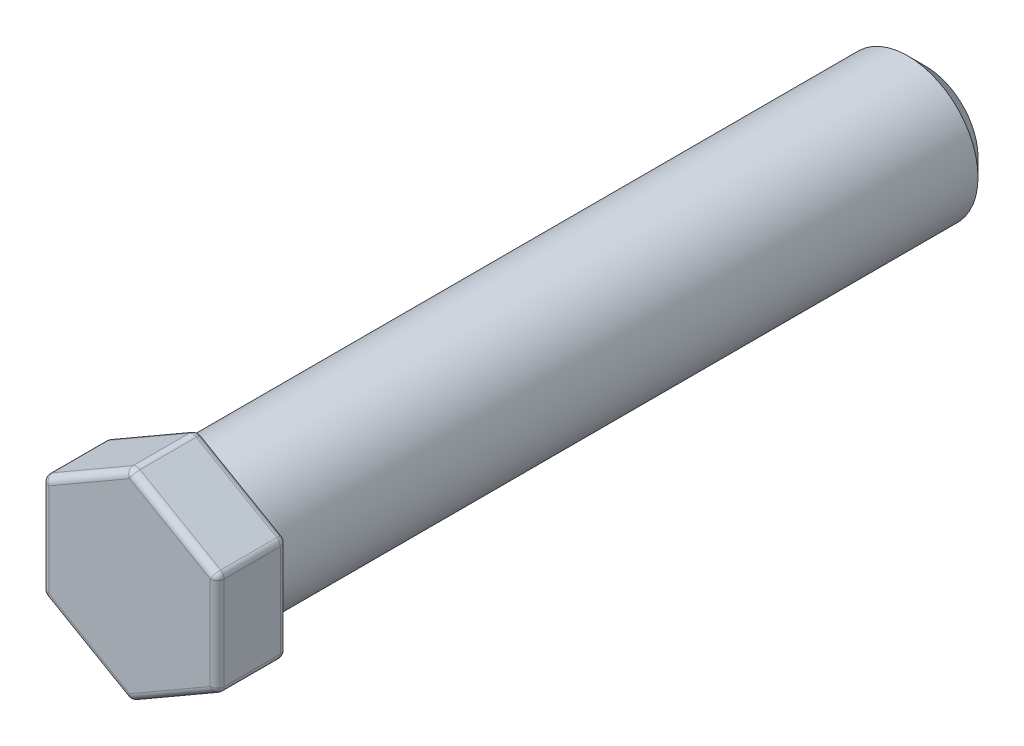
ISO-10303-21;
HEADER;
FILE_DESCRIPTION(('STEP AP214'),'2;1');
FILE_NAME('part.step','',(''),(''),'','','');
FILE_SCHEMA(('AUTOMOTIVE_DESIGN { 1 0 10303 214 1 1 1 1 }'));
ENDSEC;
DATA;
#1=APPLICATION_CONTEXT('core data for automotive mechanical design processes');
#2=APPLICATION_PROTOCOL_DEFINITION('international standard','automotive_design',2000,#1);
#3=PRODUCT_CONTEXT('',#1,'mechanical');
#4=PRODUCT('Part','Part','',(#3));
#5=PRODUCT_RELATED_PRODUCT_CATEGORY('part','',(#4));
#6=PRODUCT_DEFINITION_FORMATION('','',#4);
#7=PRODUCT_DEFINITION_CONTEXT('part definition',#1,'design');
#8=PRODUCT_DEFINITION('design','',#6,#7);
#9=PRODUCT_DEFINITION_SHAPE('','',#8);
#10=(LENGTH_UNIT() NAMED_UNIT(*) SI_UNIT(.MILLI.,.METRE.));
#11=(NAMED_UNIT(*) PLANE_ANGLE_UNIT() SI_UNIT($,.RADIAN.));
#12=(NAMED_UNIT(*) SI_UNIT($,.STERADIAN.) SOLID_ANGLE_UNIT());
#13=UNCERTAINTY_MEASURE_WITH_UNIT(LENGTH_MEASURE(1.E-05),#10,'distance_accuracy_value','');
#14=(GEOMETRIC_REPRESENTATION_CONTEXT(3) GLOBAL_UNCERTAINTY_ASSIGNED_CONTEXT((#13)) GLOBAL_UNIT_ASSIGNED_CONTEXT((#10,
#11,#12)) REPRESENTATION_CONTEXT('',''));
#15=CARTESIAN_POINT('',(0.,0.,0.));
#16=DIRECTION('',(0.,0.,1.));
#17=DIRECTION('',(1.,0.,0.));
#18=AXIS2_PLACEMENT_3D('',#15,#16,#17);
#19=CARTESIAN_POINT('',(0.,0.,20.7));
#20=DIRECTION('',(0.,0.,-1.));
#21=DIRECTION('',(-1.,0.,0.));
#22=AXIS2_PLACEMENT_3D('',#19,#20,#21);
#23=CYLINDRICAL_SURFACE('',#22,2.);
#24=CARTESIAN_POINT('',(0.,0.,0.500000000000007));
#25=DIRECTION('',(0.,0.,1.));
#26=DIRECTION('',(1.,0.,0.));
#27=AXIS2_PLACEMENT_3D('',#24,#25,#26);
#28=CIRCLE('',#27,2.);
#29=CARTESIAN_POINT('',(2.,0.,0.500000000000007));
#30=VERTEX_POINT('',#29);
#31=EDGE_CURVE('E43',#30,#30,#28,.T.);
#32=ORIENTED_EDGE('',*,*,#31,.T.);
#33=EDGE_LOOP('',(#32));
#34=FACE_BOUND('',#33,.T.);
#35=CARTESIAN_POINT('',(0.,0.,20.5));
#36=DIRECTION('',(0.,0.,1.));
#37=DIRECTION('',(1.,0.,0.));
#38=AXIS2_PLACEMENT_3D('',#35,#36,#37);
#39=CIRCLE('',#38,2.);
#40=CARTESIAN_POINT('',(2.,0.,20.5));
#41=VERTEX_POINT('',#40);
#42=EDGE_CURVE('E260',#41,#41,#39,.F.);
#43=ORIENTED_EDGE('',*,*,#42,.T.);
#44=EDGE_LOOP('',(#43));
#45=FACE_BOUND('',#44,.T.);
#46=ADVANCED_FACE('F35',(#34,#45),#23,.T.);
#47=CARTESIAN_POINT('',(0.,0.,0.));
#48=DIRECTION('',(0.,0.,1.));
#49=DIRECTION('',(1.,0.,0.));
#50=AXIS2_PLACEMENT_3D('',#47,#48,#49);
#51=PLANE('',#50);
#52=CARTESIAN_POINT('',(0.,0.,0.));
#53=DIRECTION('',(0.,0.,1.));
#54=DIRECTION('',(1.,0.,0.));
#55=AXIS2_PLACEMENT_3D('',#52,#53,#54);
#56=CIRCLE('',#55,1.49999999999999);
#57=CARTESIAN_POINT('',(1.49999999999999,0.,0.));
#58=VERTEX_POINT('',#57);
#59=EDGE_CURVE('E11',#58,#58,#56,.F.);
#60=ORIENTED_EDGE('',*,*,#59,.T.);
#61=EDGE_LOOP('',(#60));
#62=FACE_BOUND('',#61,.T.);
#63=ADVANCED_FACE('F374',(#62),#51,.F.);
#64=CARTESIAN_POINT('',(0.,-2.88675134594813,22.7));
#65=DIRECTION('',(-0.5,0.866025403784439,0.));
#66=DIRECTION('',(-0.866025403784439,-0.5,0.));
#67=AXIS2_PLACEMENT_3D('',#64,#65,#66);
#68=PLANE('',#67);
#69=DIRECTION('',(0.866025403784439,0.5,0.));
#70=VECTOR('',#69,1.);
#71=CARTESIAN_POINT('',(0.,-2.88675134594813,22.5));
#72=LINE('',#71,#70);
#73=CARTESIAN_POINT('',(2.4,-1.50111069989303,22.5));
#74=VERTEX_POINT('',#73);
#75=CARTESIAN_POINT('',(0.0999999999999994,-2.82901631902917,22.5));
#76=VERTEX_POINT('',#75);
#77=EDGE_CURVE('E237',#74,#76,#72,.F.);
#78=ORIENTED_EDGE('',*,*,#77,.T.);
#79=DIRECTION('',(0.,0.,-1.));
#80=VECTOR('',#79,1.);
#81=CARTESIAN_POINT('',(0.0999999999999995,-2.82901631902917,22.7));
#82=LINE('',#81,#80);
#83=CARTESIAN_POINT('',(0.0999999999999995,-2.82901631902917,20.9));
#84=VERTEX_POINT('',#83);
#85=EDGE_CURVE('E308',#76,#84,#82,.T.);
#86=ORIENTED_EDGE('',*,*,#85,.T.);
#87=DIRECTION('',(0.866025403784439,0.5,0.));
#88=VECTOR('',#87,1.);
#89=CARTESIAN_POINT('',(0.,-2.88675134594813,20.9));
#90=LINE('',#89,#88);
#91=CARTESIAN_POINT('',(2.4,-1.50111069989303,20.9));
#92=VERTEX_POINT('',#91);
#93=EDGE_CURVE('E234',#84,#92,#90,.T.);
#94=ORIENTED_EDGE('',*,*,#93,.T.);
#95=DIRECTION('',(0.,0.,-1.));
#96=VECTOR('',#95,1.);
#97=CARTESIAN_POINT('',(2.4,-1.50111069989303,22.7));
#98=LINE('',#97,#96);
#99=EDGE_CURVE('E306',#92,#74,#98,.F.);
#100=ORIENTED_EDGE('',*,*,#99,.T.);
#101=EDGE_LOOP('',(#78,#86,#94,#100));
#102=FACE_BOUND('',#101,.T.);
#103=ADVANCED_FACE('F379',(#102),#68,.F.);
#104=CARTESIAN_POINT('',(2.5,-1.44337567297407,22.7));
#105=DIRECTION('',(-1.,0.,0.));
#106=DIRECTION('',(0.,-1.,0.));
#107=AXIS2_PLACEMENT_3D('',#104,#105,#106);
#108=PLANE('',#107);
#109=DIRECTION('',(0.,1.,0.));
#110=VECTOR('',#109,1.);
#111=CARTESIAN_POINT('',(2.5,-1.44337567297407,20.9));
#112=LINE('',#111,#110);
#113=CARTESIAN_POINT('',(2.5,-1.32790561913614,20.9));
#114=VERTEX_POINT('',#113);
#115=CARTESIAN_POINT('',(2.5,1.32790561913614,20.9));
#116=VERTEX_POINT('',#115);
#117=EDGE_CURVE('E228',#114,#116,#112,.T.);
#118=ORIENTED_EDGE('',*,*,#117,.T.);
#119=DIRECTION('',(0.,0.,-1.));
#120=VECTOR('',#119,1.);
#121=CARTESIAN_POINT('',(2.5,1.32790561913614,22.7));
#122=LINE('',#121,#120);
#123=CARTESIAN_POINT('',(2.5,1.32790561913614,22.5));
#124=VERTEX_POINT('',#123);
#125=EDGE_CURVE('E327',#116,#124,#122,.F.);
#126=ORIENTED_EDGE('',*,*,#125,.T.);
#127=DIRECTION('',(0.,1.,0.));
#128=VECTOR('',#127,1.);
#129=CARTESIAN_POINT('',(2.5,-1.44337567297407,22.5));
#130=LINE('',#129,#128);
#131=CARTESIAN_POINT('',(2.5,-1.32790561913614,22.5));
#132=VERTEX_POINT('',#131);
#133=EDGE_CURVE('E231',#124,#132,#130,.F.);
#134=ORIENTED_EDGE('',*,*,#133,.T.);
#135=DIRECTION('',(0.,0.,-1.));
#136=VECTOR('',#135,1.);
#137=CARTESIAN_POINT('',(2.5,-1.32790561913614,22.7));
#138=LINE('',#137,#136);
#139=EDGE_CURVE('E325',#132,#114,#138,.T.);
#140=ORIENTED_EDGE('',*,*,#139,.T.);
#141=EDGE_LOOP('',(#118,#126,#134,#140));
#142=FACE_BOUND('',#141,.T.);
#143=ADVANCED_FACE('F558',(#142),#108,.F.);
#144=CARTESIAN_POINT('',(2.5,1.44337567297407,22.7));
#145=DIRECTION('',(-0.5,-0.866025403784439,0.));
#146=DIRECTION('',(0.866025403784439,-0.5,0.));
#147=AXIS2_PLACEMENT_3D('',#144,#145,#146);
#148=PLANE('',#147);
#149=DIRECTION('',(-0.866025403784439,0.5,0.));
#150=VECTOR('',#149,1.);
#151=CARTESIAN_POINT('',(2.5,1.44337567297407,22.5));
#152=LINE('',#151,#150);
#153=CARTESIAN_POINT('',(0.0999999999999994,2.82901631902917,22.5));
#154=VERTEX_POINT('',#153);
#155=CARTESIAN_POINT('',(2.4,1.50111069989303,22.5));
#156=VERTEX_POINT('',#155);
#157=EDGE_CURVE('E226',#154,#156,#152,.F.);
#158=ORIENTED_EDGE('',*,*,#157,.T.);
#159=DIRECTION('',(0.,0.,-1.));
#160=VECTOR('',#159,1.);
#161=CARTESIAN_POINT('',(2.4,1.50111069989303,22.7));
#162=LINE('',#161,#160);
#163=CARTESIAN_POINT('',(2.4,1.50111069989303,20.9));
#164=VERTEX_POINT('',#163);
#165=EDGE_CURVE('E57',#156,#164,#162,.T.);
#166=ORIENTED_EDGE('',*,*,#165,.T.);
#167=DIRECTION('',(-0.866025403784439,0.5,0.));
#168=VECTOR('',#167,1.);
#169=CARTESIAN_POINT('',(2.5,1.44337567297407,20.9));
#170=LINE('',#169,#168);
#171=CARTESIAN_POINT('',(0.0999999999999994,2.82901631902917,20.9));
#172=VERTEX_POINT('',#171);
#173=EDGE_CURVE('E224',#164,#172,#170,.T.);
#174=ORIENTED_EDGE('',*,*,#173,.T.);
#175=DIRECTION('',(0.,0.,-1.));
#176=VECTOR('',#175,1.);
#177=CARTESIAN_POINT('',(0.0999999999999994,2.82901631902917,22.7));
#178=LINE('',#177,#176);
#179=EDGE_CURVE('E322',#172,#154,#178,.F.);
#180=ORIENTED_EDGE('',*,*,#179,.T.);
#181=EDGE_LOOP('',(#158,#166,#174,#180));
#182=FACE_BOUND('',#181,.T.);
#183=ADVANCED_FACE('F503',(#182),#148,.F.);
#184=CARTESIAN_POINT('',(0.,2.88675134594813,22.7));
#185=DIRECTION('',(0.5,-0.866025403784439,0.));
#186=DIRECTION('',(0.866025403784439,0.5,0.));
#187=AXIS2_PLACEMENT_3D('',#184,#185,#186);
#188=PLANE('',#187);
#189=DIRECTION('',(-0.866025403784439,-0.5,0.));
#190=VECTOR('',#189,1.);
#191=CARTESIAN_POINT('',(0.,2.88675134594813,20.9));
#192=LINE('',#191,#190);
#193=CARTESIAN_POINT('',(-0.1,2.82901631902917,20.9));
#194=VERTEX_POINT('',#193);
#195=CARTESIAN_POINT('',(-2.4,1.50111069989303,20.9));
#196=VERTEX_POINT('',#195);
#197=EDGE_CURVE('E218',#194,#196,#192,.T.);
#198=ORIENTED_EDGE('',*,*,#197,.T.);
#199=DIRECTION('',(0.,0.,-1.));
#200=VECTOR('',#199,1.);
#201=CARTESIAN_POINT('',(-2.4,1.50111069989303,22.7));
#202=LINE('',#201,#200);
#203=CARTESIAN_POINT('',(-2.4,1.50111069989303,22.5));
#204=VERTEX_POINT('',#203);
#205=EDGE_CURVE('E320',#196,#204,#202,.F.);
#206=ORIENTED_EDGE('',*,*,#205,.T.);
#207=DIRECTION('',(-0.866025403784439,-0.5,0.));
#208=VECTOR('',#207,1.);
#209=CARTESIAN_POINT('',(0.,2.88675134594813,22.5));
#210=LINE('',#209,#208);
#211=CARTESIAN_POINT('',(-0.1,2.82901631902917,22.5));
#212=VERTEX_POINT('',#211);
#213=EDGE_CURVE('E221',#204,#212,#210,.F.);
#214=ORIENTED_EDGE('',*,*,#213,.T.);
#215=DIRECTION('',(0.,0.,-1.));
#216=VECTOR('',#215,1.);
#217=CARTESIAN_POINT('',(-0.1,2.82901631902917,22.7));
#218=LINE('',#217,#216);
#219=EDGE_CURVE('E318',#212,#194,#218,.T.);
#220=ORIENTED_EDGE('',*,*,#219,.T.);
#221=EDGE_LOOP('',(#198,#206,#214,#220));
#222=FACE_BOUND('',#221,.T.);
#223=ADVANCED_FACE('F512',(#222),#188,.F.);
#224=CARTESIAN_POINT('',(-2.5,1.44337567297407,22.7));
#225=DIRECTION('',(1.,0.,0.));
#226=DIRECTION('',(0.,1.,0.));
#227=AXIS2_PLACEMENT_3D('',#224,#225,#226);
#228=PLANE('',#227);
#229=DIRECTION('',(0.,-1.,0.));
#230=VECTOR('',#229,1.);
#231=CARTESIAN_POINT('',(-2.5,1.44337567297407,20.9));
#232=LINE('',#231,#230);
#233=CARTESIAN_POINT('',(-2.5,1.32790561913614,20.9));
#234=VERTEX_POINT('',#233);
#235=CARTESIAN_POINT('',(-2.5,-1.32790561913614,20.9));
#236=VERTEX_POINT('',#235);
#237=EDGE_CURVE('E212',#234,#236,#232,.T.);
#238=ORIENTED_EDGE('',*,*,#237,.T.);
#239=DIRECTION('',(0.,0.,-1.));
#240=VECTOR('',#239,1.);
#241=CARTESIAN_POINT('',(-2.5,-1.32790561913614,22.7));
#242=LINE('',#241,#240);
#243=CARTESIAN_POINT('',(-2.5,-1.32790561913614,22.5));
#244=VERTEX_POINT('',#243);
#245=EDGE_CURVE('E316',#236,#244,#242,.F.);
#246=ORIENTED_EDGE('',*,*,#245,.T.);
#247=DIRECTION('',(0.,-1.,0.));
#248=VECTOR('',#247,1.);
#249=CARTESIAN_POINT('',(-2.5,1.44337567297407,22.5));
#250=LINE('',#249,#248);
#251=CARTESIAN_POINT('',(-2.5,1.32790561913614,22.5));
#252=VERTEX_POINT('',#251);
#253=EDGE_CURVE('E215',#244,#252,#250,.F.);
#254=ORIENTED_EDGE('',*,*,#253,.T.);
#255=DIRECTION('',(0.,0.,-1.));
#256=VECTOR('',#255,1.);
#257=CARTESIAN_POINT('',(-2.5,1.32790561913614,22.7));
#258=LINE('',#257,#256);
#259=EDGE_CURVE('E314',#252,#234,#258,.T.);
#260=ORIENTED_EDGE('',*,*,#259,.T.);
#261=EDGE_LOOP('',(#238,#246,#254,#260));
#262=FACE_BOUND('',#261,.T.);
#263=ADVANCED_FACE('F576',(#262),#228,.F.);
#264=CARTESIAN_POINT('',(-2.5,-1.44337567297406,22.7));
#265=DIRECTION('',(0.5,0.866025403784439,0.));
#266=DIRECTION('',(-0.866025403784439,0.5,0.));
#267=AXIS2_PLACEMENT_3D('',#264,#265,#266);
#268=PLANE('',#267);
#269=DIRECTION('',(0.866025403784439,-0.5,0.));
#270=VECTOR('',#269,1.);
#271=CARTESIAN_POINT('',(-2.5,-1.44337567297406,20.9));
#272=LINE('',#271,#270);
#273=CARTESIAN_POINT('',(-2.4,-1.50111069989303,20.9));
#274=VERTEX_POINT('',#273);
#275=CARTESIAN_POINT('',(-0.1,-2.82901631902917,20.9));
#276=VERTEX_POINT('',#275);
#277=EDGE_CURVE('E203',#274,#276,#272,.T.);
#278=ORIENTED_EDGE('',*,*,#277,.T.);
#279=DIRECTION('',(0.,0.,-1.));
#280=VECTOR('',#279,1.);
#281=CARTESIAN_POINT('',(-0.1,-2.82901631902917,22.7));
#282=LINE('',#281,#280);
#283=CARTESIAN_POINT('',(-0.1,-2.82901631902917,22.5));
#284=VERTEX_POINT('',#283);
#285=EDGE_CURVE('E312',#276,#284,#282,.F.);
#286=ORIENTED_EDGE('',*,*,#285,.T.);
#287=DIRECTION('',(0.866025403784439,-0.5,0.));
#288=VECTOR('',#287,1.);
#289=CARTESIAN_POINT('',(-2.5,-1.44337567297406,22.5));
#290=LINE('',#289,#288);
#291=CARTESIAN_POINT('',(-2.4,-1.50111069989303,22.5));
#292=VERTEX_POINT('',#291);
#293=EDGE_CURVE('E184',#284,#292,#290,.F.);
#294=ORIENTED_EDGE('',*,*,#293,.T.);
#295=DIRECTION('',(0.,0.,-1.));
#296=VECTOR('',#295,1.);
#297=CARTESIAN_POINT('',(-2.4,-1.50111069989303,22.7));
#298=LINE('',#297,#296);
#299=EDGE_CURVE('E310',#292,#274,#298,.T.);
#300=ORIENTED_EDGE('',*,*,#299,.T.);
#301=EDGE_LOOP('',(#278,#286,#294,#300));
#302=FACE_BOUND('',#301,.T.);
#303=ADVANCED_FACE('F528',(#302),#268,.F.);
#304=CARTESIAN_POINT('',(0.,0.,22.7));
#305=DIRECTION('',(0.,0.,1.));
#306=DIRECTION('',(1.,0.,0.));
#307=AXIS2_PLACEMENT_3D('',#304,#305,#306);
#308=PLANE('',#307);
#309=DIRECTION('',(0.,-1.,0.));
#310=VECTOR('',#309,1.);
#311=CARTESIAN_POINT('',(-2.3,-1.44337567297406,22.7));
#312=LINE('',#311,#310);
#313=CARTESIAN_POINT('',(-2.3,1.32790561913614,22.7));
#314=VERTEX_POINT('',#313);
#315=CARTESIAN_POINT('',(-2.3,-1.32790561913614,22.7));
#316=VERTEX_POINT('',#315);
#317=EDGE_CURVE('E202',#314,#316,#312,.T.);
#318=ORIENTED_EDGE('',*,*,#317,.T.);
#319=DIRECTION('',(0.866025403784439,-0.5,0.));
#320=VECTOR('',#319,1.);
#321=CARTESIAN_POINT('',(0.0999999999999996,-2.71354626519124,22.7));
#322=LINE('',#321,#320);
#323=CARTESIAN_POINT('',(0.,-2.65581123827228,22.7));
#324=VERTEX_POINT('',#323);
#325=EDGE_CURVE('E181',#316,#324,#322,.T.);
#326=ORIENTED_EDGE('',*,*,#325,.T.);
#327=DIRECTION('',(0.866025403784439,0.5,0.));
#328=VECTOR('',#327,1.);
#329=CARTESIAN_POINT('',(2.4,-1.27017059221718,22.7));
#330=LINE('',#329,#328);
#331=CARTESIAN_POINT('',(2.3,-1.32790561913614,22.7));
#332=VERTEX_POINT('',#331);
#333=EDGE_CURVE('E189',#324,#332,#330,.T.);
#334=ORIENTED_EDGE('',*,*,#333,.T.);
#335=DIRECTION('',(0.,1.,0.));
#336=VECTOR('',#335,1.);
#337=CARTESIAN_POINT('',(2.3,1.44337567297407,22.7));
#338=LINE('',#337,#336);
#339=CARTESIAN_POINT('',(2.3,1.32790561913614,22.7));
#340=VERTEX_POINT('',#339);
#341=EDGE_CURVE('E195',#332,#340,#338,.T.);
#342=ORIENTED_EDGE('',*,*,#341,.T.);
#343=DIRECTION('',(-0.866025403784439,0.5,0.));
#344=VECTOR('',#343,1.);
#345=CARTESIAN_POINT('',(-0.1,2.71354626519124,22.7));
#346=LINE('',#345,#344);
#347=CARTESIAN_POINT('',(0.,2.65581123827228,22.7));
#348=VERTEX_POINT('',#347);
#349=EDGE_CURVE('E519',#340,#348,#346,.T.);
#350=ORIENTED_EDGE('',*,*,#349,.T.);
#351=DIRECTION('',(-0.866025403784439,-0.5,0.));
#352=VECTOR('',#351,1.);
#353=CARTESIAN_POINT('',(-2.4,1.27017059221718,22.7));
#354=LINE('',#353,#352);
#355=EDGE_CURVE('E207',#348,#314,#354,.T.);
#356=ORIENTED_EDGE('',*,*,#355,.T.);
#357=EDGE_LOOP('',(#318,#326,#334,#342,#350,#356));
#358=FACE_BOUND('',#357,.T.);
#359=ADVANCED_FACE('F199',(#358),#308,.T.);
#360=CARTESIAN_POINT('',(0.,0.,20.7));
#361=DIRECTION('',(0.,0.,1.));
#362=DIRECTION('',(1.,0.,0.));
#363=AXIS2_PLACEMENT_3D('',#360,#361,#362);
#364=PLANE('',#363);
#365=DIRECTION('',(-0.866025403784439,0.5,0.));
#366=VECTOR('',#365,1.);
#367=CARTESIAN_POINT('',(1.15,1.99185842870421,20.7));
#368=LINE('',#367,#366);
#369=CARTESIAN_POINT('',(0.,2.65581123827228,20.7));
#370=VERTEX_POINT('',#369);
#371=CARTESIAN_POINT('',(2.3,1.32790561913614,20.7));
#372=VERTEX_POINT('',#371);
#373=EDGE_CURVE('E254',#370,#372,#368,.F.);
#374=ORIENTED_EDGE('',*,*,#373,.T.);
#375=DIRECTION('',(0.,1.,0.));
#376=VECTOR('',#375,1.);
#377=CARTESIAN_POINT('',(2.3,0.,20.7));
#378=LINE('',#377,#376);
#379=CARTESIAN_POINT('',(2.3,-1.32790561913614,20.7));
#380=VERTEX_POINT('',#379);
#381=EDGE_CURVE('E257',#372,#380,#378,.F.);
#382=ORIENTED_EDGE('',*,*,#381,.T.);
#383=DIRECTION('',(0.866025403784439,0.5,0.));
#384=VECTOR('',#383,1.);
#385=CARTESIAN_POINT('',(1.15,-1.99185842870421,20.7));
#386=LINE('',#385,#384);
#387=CARTESIAN_POINT('',(0.,-2.65581123827228,20.7));
#388=VERTEX_POINT('',#387);
#389=EDGE_CURVE('E242',#380,#388,#386,.F.);
#390=ORIENTED_EDGE('',*,*,#389,.T.);
#391=DIRECTION('',(0.866025403784439,-0.5,0.));
#392=VECTOR('',#391,1.);
#393=CARTESIAN_POINT('',(-1.15,-1.99185842870421,20.7));
#394=LINE('',#393,#392);
#395=CARTESIAN_POINT('',(-2.3,-1.32790561913614,20.7));
#396=VERTEX_POINT('',#395);
#397=EDGE_CURVE('E245',#388,#396,#394,.F.);
#398=ORIENTED_EDGE('',*,*,#397,.T.);
#399=DIRECTION('',(0.,-1.,0.));
#400=VECTOR('',#399,1.);
#401=CARTESIAN_POINT('',(-2.3,0.,20.7));
#402=LINE('',#401,#400);
#403=CARTESIAN_POINT('',(-2.3,1.32790561913614,20.7));
#404=VERTEX_POINT('',#403);
#405=EDGE_CURVE('E248',#396,#404,#402,.F.);
#406=ORIENTED_EDGE('',*,*,#405,.T.);
#407=DIRECTION('',(-0.866025403784439,-0.5,0.));
#408=VECTOR('',#407,1.);
#409=CARTESIAN_POINT('',(-1.15,1.99185842870421,20.7));
#410=LINE('',#409,#408);
#411=EDGE_CURVE('E251',#404,#370,#410,.F.);
#412=ORIENTED_EDGE('',*,*,#411,.T.);
#413=EDGE_LOOP('',(#374,#382,#390,#398,#406,#412));
#414=FACE_BOUND('',#413,.T.);
#415=CARTESIAN_POINT('',(0.,0.,20.7));
#416=DIRECTION('',(0.,0.,1.));
#417=DIRECTION('',(1.,0.,0.));
#418=AXIS2_PLACEMENT_3D('',#415,#416,#417);
#419=CIRCLE('',#418,2.2);
#420=CARTESIAN_POINT('',(2.2,0.,20.7));
#421=VERTEX_POINT('',#420);
#422=EDGE_CURVE('E239',#421,#421,#419,.T.);
#423=ORIENTED_EDGE('',*,*,#422,.T.);
#424=EDGE_LOOP('',(#423));
#425=FACE_BOUND('',#424,.T.);
#426=ADVANCED_FACE('F404',(#414,#425),#364,.F.);
#427=CARTESIAN_POINT('',(1.15,1.99185842870421,22.5));
#428=DIRECTION('',(0.866025403784439,-0.5,0.));
#429=DIRECTION('',(0.5,0.866025403784439,0.));
#430=AXIS2_PLACEMENT_3D('',#427,#428,#429);
#431=CYLINDRICAL_SURFACE('',#430,0.2);
#432=ORIENTED_EDGE('',*,*,#349,.F.);
#433=CARTESIAN_POINT('',(2.3,1.32790561913614,22.5));
#434=DIRECTION('',(0.866025403784439,-0.5,0.));
#435=DIRECTION('',(0.5,0.866025403784439,0.));
#436=AXIS2_PLACEMENT_3D('',#433,#434,#435);
#437=CIRCLE('',#436,0.2);
#438=EDGE_CURVE('E297',#340,#156,#437,.F.);
#439=ORIENTED_EDGE('',*,*,#438,.T.);
#440=ORIENTED_EDGE('',*,*,#157,.F.);
#441=CARTESIAN_POINT('',(0.,2.65581123827228,22.5));
#442=DIRECTION('',(0.866025403784439,-0.5,0.));
#443=DIRECTION('',(0.5,0.866025403784439,0.));
#444=AXIS2_PLACEMENT_3D('',#441,#442,#443);
#445=CIRCLE('',#444,0.2);
#446=EDGE_CURVE('E295',#154,#348,#445,.T.);
#447=ORIENTED_EDGE('',*,*,#446,.T.);
#448=EDGE_LOOP('',(#432,#439,#440,#447));
#449=FACE_BOUND('',#448,.T.);
#450=ADVANCED_FACE('F400',(#449),#431,.T.);
#451=CARTESIAN_POINT('',(-1.15,1.99185842870421,22.5));
#452=DIRECTION('',(0.866025403784439,0.5,0.));
#453=DIRECTION('',(-0.5,0.866025403784439,0.));
#454=AXIS2_PLACEMENT_3D('',#451,#452,#453);
#455=CYLINDRICAL_SURFACE('',#454,0.2);
#456=ORIENTED_EDGE('',*,*,#213,.F.);
#457=CARTESIAN_POINT('',(-2.3,1.32790561913614,22.5));
#458=DIRECTION('',(0.866025403784439,0.5,0.));
#459=DIRECTION('',(-0.5,0.866025403784439,0.));
#460=AXIS2_PLACEMENT_3D('',#457,#458,#459);
#461=CIRCLE('',#460,0.2);
#462=EDGE_CURVE('E284',#204,#314,#461,.T.);
#463=ORIENTED_EDGE('',*,*,#462,.T.);
#464=ORIENTED_EDGE('',*,*,#355,.F.);
#465=CARTESIAN_POINT('',(0.,2.65581123827228,22.5));
#466=DIRECTION('',(0.866025403784439,0.5,0.));
#467=DIRECTION('',(-0.5,0.866025403784439,0.));
#468=AXIS2_PLACEMENT_3D('',#465,#466,#467);
#469=CIRCLE('',#468,0.2);
#470=EDGE_CURVE('E281',#348,#212,#469,.F.);
#471=ORIENTED_EDGE('',*,*,#470,.T.);
#472=EDGE_LOOP('',(#456,#463,#464,#471));
#473=FACE_BOUND('',#472,.T.);
#474=ADVANCED_FACE('F396',(#473),#455,.T.);
#475=CARTESIAN_POINT('',(2.3,0.,22.5));
#476=DIRECTION('',(0.,-1.,0.));
#477=DIRECTION('',(1.,0.,0.));
#478=AXIS2_PLACEMENT_3D('',#475,#476,#477);
#479=CYLINDRICAL_SURFACE('',#478,0.2);
#480=ORIENTED_EDGE('',*,*,#133,.F.);
#481=CARTESIAN_POINT('',(2.3,1.32790561913614,22.5));
#482=DIRECTION('',(0.,-1.,0.));
#483=DIRECTION('',(1.,0.,0.));
#484=AXIS2_PLACEMENT_3D('',#481,#482,#483);
#485=CIRCLE('',#484,0.2);
#486=EDGE_CURVE('E292',#124,#340,#485,.T.);
#487=ORIENTED_EDGE('',*,*,#486,.T.);
#488=ORIENTED_EDGE('',*,*,#341,.F.);
#489=CARTESIAN_POINT('',(2.3,-1.32790561913614,22.5));
#490=DIRECTION('',(0.,-1.,0.));
#491=DIRECTION('',(1.,0.,0.));
#492=AXIS2_PLACEMENT_3D('',#489,#490,#491);
#493=CIRCLE('',#492,0.2);
#494=EDGE_CURVE('E290',#332,#132,#493,.F.);
#495=ORIENTED_EDGE('',*,*,#494,.T.);
#496=EDGE_LOOP('',(#480,#487,#488,#495));
#497=FACE_BOUND('',#496,.T.);
#498=ADVANCED_FACE('F392',(#497),#479,.T.);
#499=CARTESIAN_POINT('',(-2.3,0.,22.5));
#500=DIRECTION('',(0.,1.,0.));
#501=DIRECTION('',(-1.,0.,0.));
#502=AXIS2_PLACEMENT_3D('',#499,#500,#501);
#503=CYLINDRICAL_SURFACE('',#502,0.2);
#504=ORIENTED_EDGE('',*,*,#253,.F.);
#505=CARTESIAN_POINT('',(-2.3,-1.32790561913614,22.5));
#506=DIRECTION('',(0.,1.,0.));
#507=DIRECTION('',(-1.,0.,0.));
#508=AXIS2_PLACEMENT_3D('',#505,#506,#507);
#509=CIRCLE('',#508,0.2);
#510=EDGE_CURVE('E275',#244,#316,#509,.T.);
#511=ORIENTED_EDGE('',*,*,#510,.T.);
#512=ORIENTED_EDGE('',*,*,#317,.F.);
#513=CARTESIAN_POINT('',(-2.3,1.32790561913614,22.5));
#514=DIRECTION('',(0.,1.,0.));
#515=DIRECTION('',(-1.,0.,0.));
#516=AXIS2_PLACEMENT_3D('',#513,#514,#515);
#517=CIRCLE('',#516,0.2);
#518=EDGE_CURVE('E272',#314,#252,#517,.F.);
#519=ORIENTED_EDGE('',*,*,#518,.T.);
#520=EDGE_LOOP('',(#504,#511,#512,#519));
#521=FACE_BOUND('',#520,.T.);
#522=ADVANCED_FACE('F389',(#521),#503,.T.);
#523=CARTESIAN_POINT('',(1.15,-1.99185842870421,22.5));
#524=DIRECTION('',(-0.866025403784439,-0.5,0.));
#525=DIRECTION('',(0.5,-0.866025403784439,0.));
#526=AXIS2_PLACEMENT_3D('',#523,#524,#525);
#527=CYLINDRICAL_SURFACE('',#526,0.2);
#528=ORIENTED_EDGE('',*,*,#333,.F.);
#529=CARTESIAN_POINT('',(0.,-2.65581123827228,22.5));
#530=DIRECTION('',(-0.866025403784439,-0.5,0.));
#531=DIRECTION('',(0.5,-0.866025403784439,0.));
#532=AXIS2_PLACEMENT_3D('',#529,#530,#531);
#533=CIRCLE('',#532,0.2);
#534=EDGE_CURVE('E162',#324,#76,#533,.F.);
#535=ORIENTED_EDGE('',*,*,#534,.T.);
#536=ORIENTED_EDGE('',*,*,#77,.F.);
#537=CARTESIAN_POINT('',(2.3,-1.32790561913614,22.5));
#538=DIRECTION('',(-0.866025403784439,-0.5,0.));
#539=DIRECTION('',(0.5,-0.866025403784439,0.));
#540=AXIS2_PLACEMENT_3D('',#537,#538,#539);
#541=CIRCLE('',#540,0.2);
#542=EDGE_CURVE('E173',#74,#332,#541,.T.);
#543=ORIENTED_EDGE('',*,*,#542,.T.);
#544=EDGE_LOOP('',(#528,#535,#536,#543));
#545=FACE_BOUND('',#544,.T.);
#546=ADVANCED_FACE('F190',(#545),#527,.T.);
#547=CARTESIAN_POINT('',(-1.15,-1.99185842870421,22.5));
#548=DIRECTION('',(-0.866025403784439,0.5,0.));
#549=DIRECTION('',(-0.5,-0.866025403784439,0.));
#550=AXIS2_PLACEMENT_3D('',#547,#548,#549);
#551=CYLINDRICAL_SURFACE('',#550,0.2);
#552=ORIENTED_EDGE('',*,*,#293,.F.);
#553=CARTESIAN_POINT('',(0.,-2.65581123827228,22.5));
#554=DIRECTION('',(-0.866025403784439,0.5,0.));
#555=DIRECTION('',(-0.5,-0.866025403784439,0.));
#556=AXIS2_PLACEMENT_3D('',#553,#554,#555);
#557=CIRCLE('',#556,0.2);
#558=EDGE_CURVE('E165',#284,#324,#557,.T.);
#559=ORIENTED_EDGE('',*,*,#558,.T.);
#560=ORIENTED_EDGE('',*,*,#325,.F.);
#561=CARTESIAN_POINT('',(-2.3,-1.32790561913614,22.5));
#562=DIRECTION('',(-0.866025403784439,0.5,0.));
#563=DIRECTION('',(-0.5,-0.866025403784439,0.));
#564=AXIS2_PLACEMENT_3D('',#561,#562,#563);
#565=CIRCLE('',#564,0.2);
#566=EDGE_CURVE('E185',#316,#292,#565,.F.);
#567=ORIENTED_EDGE('',*,*,#566,.T.);
#568=EDGE_LOOP('',(#552,#559,#560,#567));
#569=FACE_BOUND('',#568,.T.);
#570=ADVANCED_FACE('F178',(#569),#551,.T.);
#571=CARTESIAN_POINT('',(-2.3,1.44337567297407,20.9));
#572=DIRECTION('',(0.,-1.,0.));
#573=DIRECTION('',(1.,0.,0.));
#574=AXIS2_PLACEMENT_3D('',#571,#572,#573);
#575=CYLINDRICAL_SURFACE('',#574,0.2);
#576=ORIENTED_EDGE('',*,*,#405,.F.);
#577=CARTESIAN_POINT('',(-2.3,-1.32790561913614,20.9));
#578=DIRECTION('',(0.,-1.,0.));
#579=DIRECTION('',(1.,0.,0.));
#580=AXIS2_PLACEMENT_3D('',#577,#578,#579);
#581=CIRCLE('',#580,0.2);
#582=EDGE_CURVE('E279',#396,#236,#581,.F.);
#583=ORIENTED_EDGE('',*,*,#582,.T.);
#584=ORIENTED_EDGE('',*,*,#237,.F.);
#585=CARTESIAN_POINT('',(-2.3,1.32790561913614,20.9));
#586=DIRECTION('',(0.,-1.,0.));
#587=DIRECTION('',(1.,0.,0.));
#588=AXIS2_PLACEMENT_3D('',#585,#586,#587);
#589=CIRCLE('',#588,0.2);
#590=EDGE_CURVE('E277',#234,#404,#589,.T.);
#591=ORIENTED_EDGE('',*,*,#590,.T.);
#592=EDGE_LOOP('',(#576,#583,#584,#591));
#593=FACE_BOUND('',#592,.T.);
#594=ADVANCED_FACE('F386',(#593),#575,.T.);
#595=CARTESIAN_POINT('',(-2.4,-1.27017059221718,20.9));
#596=DIRECTION('',(0.866025403784439,-0.5,0.));
#597=DIRECTION('',(0.5,0.866025403784439,0.));
#598=AXIS2_PLACEMENT_3D('',#595,#596,#597);
#599=CYLINDRICAL_SURFACE('',#598,0.2);
#600=ORIENTED_EDGE('',*,*,#397,.F.);
#601=CARTESIAN_POINT('',(0.,-2.65581123827228,20.9));
#602=DIRECTION('',(0.866025403784439,-0.5,0.));
#603=DIRECTION('',(0.5,0.866025403784439,0.));
#604=AXIS2_PLACEMENT_3D('',#601,#602,#603);
#605=CIRCLE('',#604,0.2);
#606=EDGE_CURVE('E270',#388,#276,#605,.F.);
#607=ORIENTED_EDGE('',*,*,#606,.T.);
#608=ORIENTED_EDGE('',*,*,#277,.F.);
#609=CARTESIAN_POINT('',(-2.3,-1.32790561913614,20.9));
#610=DIRECTION('',(0.866025403784439,-0.5,0.));
#611=DIRECTION('',(0.5,0.866025403784439,0.));
#612=AXIS2_PLACEMENT_3D('',#609,#610,#611);
#613=CIRCLE('',#612,0.2);
#614=EDGE_CURVE('E268',#274,#396,#613,.T.);
#615=ORIENTED_EDGE('',*,*,#614,.T.);
#616=EDGE_LOOP('',(#600,#607,#608,#615));
#617=FACE_BOUND('',#616,.T.);
#618=ADVANCED_FACE('F421',(#617),#599,.T.);
#619=CARTESIAN_POINT('',(0.0999999999999996,2.71354626519124,20.9));
#620=DIRECTION('',(-0.866025403784439,-0.5,0.));
#621=DIRECTION('',(0.5,-0.866025403784439,0.));
#622=AXIS2_PLACEMENT_3D('',#619,#620,#621);
#623=CYLINDRICAL_SURFACE('',#622,0.2);
#624=ORIENTED_EDGE('',*,*,#411,.F.);
#625=CARTESIAN_POINT('',(-2.3,1.32790561913614,20.9));
#626=DIRECTION('',(-0.866025403784439,-0.5,0.));
#627=DIRECTION('',(0.5,-0.866025403784439,0.));
#628=AXIS2_PLACEMENT_3D('',#625,#626,#627);
#629=CIRCLE('',#628,0.2);
#630=EDGE_CURVE('E288',#404,#196,#629,.F.);
#631=ORIENTED_EDGE('',*,*,#630,.T.);
#632=ORIENTED_EDGE('',*,*,#197,.F.);
#633=CARTESIAN_POINT('',(0.,2.65581123827228,20.9));
#634=DIRECTION('',(-0.866025403784439,-0.5,0.));
#635=DIRECTION('',(0.5,-0.866025403784439,0.));
#636=AXIS2_PLACEMENT_3D('',#633,#634,#635);
#637=CIRCLE('',#636,0.2);
#638=EDGE_CURVE('E286',#194,#370,#637,.T.);
#639=ORIENTED_EDGE('',*,*,#638,.T.);
#640=EDGE_LOOP('',(#624,#631,#632,#639));
#641=FACE_BOUND('',#640,.T.);
#642=ADVANCED_FACE('F417',(#641),#623,.T.);
#643=CARTESIAN_POINT('',(-0.1,-2.71354626519124,20.9));
#644=DIRECTION('',(0.866025403784439,0.5,0.));
#645=DIRECTION('',(-0.5,0.866025403784439,0.));
#646=AXIS2_PLACEMENT_3D('',#643,#644,#645);
#647=CYLINDRICAL_SURFACE('',#646,0.2);
#648=ORIENTED_EDGE('',*,*,#93,.F.);
#649=CARTESIAN_POINT('',(0.,-2.65581123827228,20.9));
#650=DIRECTION('',(0.866025403784439,0.5,0.));
#651=DIRECTION('',(-0.5,0.866025403784439,0.));
#652=AXIS2_PLACEMENT_3D('',#649,#650,#651);
#653=CIRCLE('',#652,0.2);
#654=EDGE_CURVE('E266',#84,#388,#653,.T.);
#655=ORIENTED_EDGE('',*,*,#654,.T.);
#656=ORIENTED_EDGE('',*,*,#389,.F.);
#657=CARTESIAN_POINT('',(2.3,-1.32790561913614,20.9));
#658=DIRECTION('',(0.866025403784439,0.5,0.));
#659=DIRECTION('',(-0.5,0.866025403784439,0.));
#660=AXIS2_PLACEMENT_3D('',#657,#658,#659);
#661=CIRCLE('',#660,0.2);
#662=EDGE_CURVE('E172',#380,#92,#661,.F.);
#663=ORIENTED_EDGE('',*,*,#662,.T.);
#664=EDGE_LOOP('',(#648,#655,#656,#663));
#665=FACE_BOUND('',#664,.T.);
#666=ADVANCED_FACE('F414',(#665),#647,.T.);
#667=CARTESIAN_POINT('',(2.4,1.27017059221718,20.9));
#668=DIRECTION('',(-0.866025403784439,0.5,0.));
#669=DIRECTION('',(-0.5,-0.866025403784439,0.));
#670=AXIS2_PLACEMENT_3D('',#667,#668,#669);
#671=CYLINDRICAL_SURFACE('',#670,0.2);
#672=ORIENTED_EDGE('',*,*,#173,.F.);
#673=CARTESIAN_POINT('',(2.3,1.32790561913614,20.9));
#674=DIRECTION('',(-0.866025403784439,0.5,0.));
#675=DIRECTION('',(-0.5,-0.866025403784439,0.));
#676=AXIS2_PLACEMENT_3D('',#673,#674,#675);
#677=CIRCLE('',#676,0.2);
#678=EDGE_CURVE('E304',#164,#372,#677,.T.);
#679=ORIENTED_EDGE('',*,*,#678,.T.);
#680=ORIENTED_EDGE('',*,*,#373,.F.);
#681=CARTESIAN_POINT('',(0.,2.65581123827228,20.9));
#682=DIRECTION('',(-0.866025403784439,0.5,0.));
#683=DIRECTION('',(-0.5,-0.866025403784439,0.));
#684=AXIS2_PLACEMENT_3D('',#681,#682,#683);
#685=CIRCLE('',#684,0.2);
#686=EDGE_CURVE('E50',#370,#172,#685,.F.);
#687=ORIENTED_EDGE('',*,*,#686,.T.);
#688=EDGE_LOOP('',(#672,#679,#680,#687));
#689=FACE_BOUND('',#688,.T.);
#690=ADVANCED_FACE('F410',(#689),#671,.T.);
#691=CARTESIAN_POINT('',(2.3,-1.44337567297407,20.9));
#692=DIRECTION('',(0.,1.,0.));
#693=DIRECTION('',(-1.,0.,0.));
#694=AXIS2_PLACEMENT_3D('',#691,#692,#693);
#695=CYLINDRICAL_SURFACE('',#694,0.2);
#696=ORIENTED_EDGE('',*,*,#381,.F.);
#697=CARTESIAN_POINT('',(2.3,1.32790561913614,20.9));
#698=DIRECTION('',(0.,1.,0.));
#699=DIRECTION('',(-1.,0.,0.));
#700=AXIS2_PLACEMENT_3D('',#697,#698,#699);
#701=CIRCLE('',#700,0.2);
#702=EDGE_CURVE('E301',#372,#116,#701,.F.);
#703=ORIENTED_EDGE('',*,*,#702,.T.);
#704=ORIENTED_EDGE('',*,*,#117,.F.);
#705=CARTESIAN_POINT('',(2.3,-1.32790561913614,20.9));
#706=DIRECTION('',(0.,1.,0.));
#707=DIRECTION('',(-1.,0.,0.));
#708=AXIS2_PLACEMENT_3D('',#705,#706,#707);
#709=CIRCLE('',#708,0.2);
#710=EDGE_CURVE('E299',#114,#380,#709,.T.);
#711=ORIENTED_EDGE('',*,*,#710,.T.);
#712=EDGE_LOOP('',(#696,#703,#704,#711));
#713=FACE_BOUND('',#712,.T.);
#714=ADVANCED_FACE('F406',(#713),#695,.T.);
#715=CARTESIAN_POINT('',(0.,0.,20.5));
#716=DIRECTION('',(0.,0.,1.));
#717=DIRECTION('',(1.,0.,0.));
#718=AXIS2_PLACEMENT_3D('',#715,#716,#717);
#719=TOROIDAL_SURFACE('',#718,2.2,0.2);
#720=ORIENTED_EDGE('',*,*,#42,.F.);
#721=EDGE_LOOP('',(#720));
#722=FACE_BOUND('',#721,.T.);
#723=ORIENTED_EDGE('',*,*,#422,.F.);
#724=EDGE_LOOP('',(#723));
#725=FACE_BOUND('',#724,.T.);
#726=ADVANCED_FACE('F409',(#722,#725),#719,.F.);
#727=CARTESIAN_POINT('',(0.,-2.65581123827228,20.9));
#728=DIRECTION('',(0.,0.,1.));
#729=DIRECTION('',(1.,0.,0.));
#730=AXIS2_PLACEMENT_3D('',#727,#728,#729);
#731=SPHERICAL_SURFACE('',#730,0.2);
#732=ORIENTED_EDGE('',*,*,#606,.F.);
#733=ORIENTED_EDGE('',*,*,#654,.F.);
#734=CARTESIAN_POINT('',(0.,-2.65581123827228,20.9));
#735=DIRECTION('',(0.,0.,1.));
#736=DIRECTION('',(1.,0.,0.));
#737=AXIS2_PLACEMENT_3D('',#734,#735,#736);
#738=CIRCLE('',#737,0.2);
#739=EDGE_CURVE('E196',#276,#84,#738,.T.);
#740=ORIENTED_EDGE('',*,*,#739,.F.);
#741=EDGE_LOOP('',(#732,#733,#740));
#742=FACE_BOUND('',#741,.T.);
#743=ADVANCED_FACE('F431',(#742),#731,.T.);
#744=CARTESIAN_POINT('',(0.,-2.65581123827228,22.7));
#745=DIRECTION('',(0.,0.,-1.));
#746=DIRECTION('',(-1.,0.,0.));
#747=AXIS2_PLACEMENT_3D('',#744,#745,#746);
#748=CYLINDRICAL_SURFACE('',#747,0.2);
#749=ORIENTED_EDGE('',*,*,#739,.T.);
#750=ORIENTED_EDGE('',*,*,#85,.F.);
#751=CARTESIAN_POINT('',(0.,-2.65581123827228,22.5));
#752=DIRECTION('',(0.,0.,1.));
#753=DIRECTION('',(1.,0.,0.));
#754=AXIS2_PLACEMENT_3D('',#751,#752,#753);
#755=CIRCLE('',#754,0.2);
#756=EDGE_CURVE('E167',#284,#76,#755,.T.);
#757=ORIENTED_EDGE('',*,*,#756,.F.);
#758=ORIENTED_EDGE('',*,*,#285,.F.);
#759=EDGE_LOOP('',(#749,#750,#757,#758));
#760=FACE_BOUND('',#759,.T.);
#761=ADVANCED_FACE('F436',(#760),#748,.T.);
#762=CARTESIAN_POINT('',(0.,-2.65581123827228,22.5));
#763=DIRECTION('',(0.,0.,1.));
#764=DIRECTION('',(1.,0.,0.));
#765=AXIS2_PLACEMENT_3D('',#762,#763,#764);
#766=SPHERICAL_SURFACE('',#765,0.2);
#767=ORIENTED_EDGE('',*,*,#756,.T.);
#768=ORIENTED_EDGE('',*,*,#534,.F.);
#769=ORIENTED_EDGE('',*,*,#558,.F.);
#770=EDGE_LOOP('',(#767,#768,#769));
#771=FACE_BOUND('',#770,.T.);
#772=ADVANCED_FACE('F164',(#771),#766,.T.);
#773=CARTESIAN_POINT('',(-2.3,-1.32790561913614,20.9));
#774=DIRECTION('',(0.,0.,1.));
#775=DIRECTION('',(1.,0.,0.));
#776=AXIS2_PLACEMENT_3D('',#773,#774,#775);
#777=SPHERICAL_SURFACE('',#776,0.2);
#778=ORIENTED_EDGE('',*,*,#582,.F.);
#779=ORIENTED_EDGE('',*,*,#614,.F.);
#780=CARTESIAN_POINT('',(-2.3,-1.32790561913614,20.9));
#781=DIRECTION('',(0.,0.,1.));
#782=DIRECTION('',(1.,0.,0.));
#783=AXIS2_PLACEMENT_3D('',#780,#781,#782);
#784=CIRCLE('',#783,0.2);
#785=EDGE_CURVE('E330',#236,#274,#784,.T.);
#786=ORIENTED_EDGE('',*,*,#785,.F.);
#787=EDGE_LOOP('',(#778,#779,#786));
#788=FACE_BOUND('',#787,.T.);
#789=ADVANCED_FACE('F435',(#788),#777,.T.);
#790=CARTESIAN_POINT('',(-2.3,-1.32790561913614,22.7));
#791=DIRECTION('',(0.,0.,-1.));
#792=DIRECTION('',(-1.,0.,0.));
#793=AXIS2_PLACEMENT_3D('',#790,#791,#792);
#794=CYLINDRICAL_SURFACE('',#793,0.2);
#795=ORIENTED_EDGE('',*,*,#785,.T.);
#796=ORIENTED_EDGE('',*,*,#299,.F.);
#797=CARTESIAN_POINT('',(-2.3,-1.32790561913614,22.5));
#798=DIRECTION('',(0.,0.,1.));
#799=DIRECTION('',(1.,0.,0.));
#800=AXIS2_PLACEMENT_3D('',#797,#798,#799);
#801=CIRCLE('',#800,0.2);
#802=EDGE_CURVE('E333',#244,#292,#801,.T.);
#803=ORIENTED_EDGE('',*,*,#802,.F.);
#804=ORIENTED_EDGE('',*,*,#245,.F.);
#805=EDGE_LOOP('',(#795,#796,#803,#804));
#806=FACE_BOUND('',#805,.T.);
#807=ADVANCED_FACE('F447',(#806),#794,.T.);
#808=CARTESIAN_POINT('',(-2.3,-1.32790561913614,22.5));
#809=DIRECTION('',(0.,0.,1.));
#810=DIRECTION('',(1.,0.,0.));
#811=AXIS2_PLACEMENT_3D('',#808,#809,#810);
#812=SPHERICAL_SURFACE('',#811,0.2);
#813=ORIENTED_EDGE('',*,*,#566,.F.);
#814=ORIENTED_EDGE('',*,*,#510,.F.);
#815=ORIENTED_EDGE('',*,*,#802,.T.);
#816=EDGE_LOOP('',(#813,#814,#815));
#817=FACE_BOUND('',#816,.T.);
#818=ADVANCED_FACE('F443',(#817),#812,.T.);
#819=CARTESIAN_POINT('',(-2.3,1.32790561913614,20.9));
#820=DIRECTION('',(0.,0.,1.));
#821=DIRECTION('',(1.,0.,0.));
#822=AXIS2_PLACEMENT_3D('',#819,#820,#821);
#823=SPHERICAL_SURFACE('',#822,0.2);
#824=ORIENTED_EDGE('',*,*,#630,.F.);
#825=ORIENTED_EDGE('',*,*,#590,.F.);
#826=CARTESIAN_POINT('',(-2.3,1.32790561913614,20.9));
#827=DIRECTION('',(0.,0.,1.));
#828=DIRECTION('',(1.,0.,0.));
#829=AXIS2_PLACEMENT_3D('',#826,#827,#828);
#830=CIRCLE('',#829,0.2);
#831=EDGE_CURVE('E335',#196,#234,#830,.T.);
#832=ORIENTED_EDGE('',*,*,#831,.F.);
#833=EDGE_LOOP('',(#824,#825,#832));
#834=FACE_BOUND('',#833,.T.);
#835=ADVANCED_FACE('F446',(#834),#823,.T.);
#836=CARTESIAN_POINT('',(-2.3,1.32790561913614,22.7));
#837=DIRECTION('',(0.,0.,-1.));
#838=DIRECTION('',(-1.,0.,0.));
#839=AXIS2_PLACEMENT_3D('',#836,#837,#838);
#840=CYLINDRICAL_SURFACE('',#839,0.2);
#841=ORIENTED_EDGE('',*,*,#831,.T.);
#842=ORIENTED_EDGE('',*,*,#259,.F.);
#843=CARTESIAN_POINT('',(-2.3,1.32790561913614,22.5));
#844=DIRECTION('',(0.,0.,1.));
#845=DIRECTION('',(1.,0.,0.));
#846=AXIS2_PLACEMENT_3D('',#843,#844,#845);
#847=CIRCLE('',#846,0.2);
#848=EDGE_CURVE('E338',#204,#252,#847,.T.);
#849=ORIENTED_EDGE('',*,*,#848,.F.);
#850=ORIENTED_EDGE('',*,*,#205,.F.);
#851=EDGE_LOOP('',(#841,#842,#849,#850));
#852=FACE_BOUND('',#851,.T.);
#853=ADVANCED_FACE('F459',(#852),#840,.T.);
#854=CARTESIAN_POINT('',(-2.3,1.32790561913614,22.5));
#855=DIRECTION('',(0.,0.,1.));
#856=DIRECTION('',(1.,0.,0.));
#857=AXIS2_PLACEMENT_3D('',#854,#855,#856);
#858=SPHERICAL_SURFACE('',#857,0.2);
#859=ORIENTED_EDGE('',*,*,#518,.F.);
#860=ORIENTED_EDGE('',*,*,#462,.F.);
#861=ORIENTED_EDGE('',*,*,#848,.T.);
#862=EDGE_LOOP('',(#859,#860,#861));
#863=FACE_BOUND('',#862,.T.);
#864=ADVANCED_FACE('F455',(#863),#858,.T.);
#865=CARTESIAN_POINT('',(2.3,1.32790561913614,20.9));
#866=DIRECTION('',(0.,0.,1.));
#867=DIRECTION('',(1.,0.,0.));
#868=AXIS2_PLACEMENT_3D('',#865,#866,#867);
#869=SPHERICAL_SURFACE('',#868,0.2);
#870=ORIENTED_EDGE('',*,*,#702,.F.);
#871=ORIENTED_EDGE('',*,*,#678,.F.);
#872=CARTESIAN_POINT('',(2.3,1.32790561913614,20.9));
#873=DIRECTION('',(0.,0.,1.));
#874=DIRECTION('',(1.,0.,0.));
#875=AXIS2_PLACEMENT_3D('',#872,#873,#874);
#876=CIRCLE('',#875,0.2);
#877=EDGE_CURVE('E340',#116,#164,#876,.T.);
#878=ORIENTED_EDGE('',*,*,#877,.F.);
#879=EDGE_LOOP('',(#870,#871,#878));
#880=FACE_BOUND('',#879,.T.);
#881=ADVANCED_FACE('F458',(#880),#869,.T.);
#882=CARTESIAN_POINT('',(2.3,1.32790561913614,22.7));
#883=DIRECTION('',(0.,0.,-1.));
#884=DIRECTION('',(-1.,0.,0.));
#885=AXIS2_PLACEMENT_3D('',#882,#883,#884);
#886=CYLINDRICAL_SURFACE('',#885,0.2);
#887=ORIENTED_EDGE('',*,*,#877,.T.);
#888=ORIENTED_EDGE('',*,*,#165,.F.);
#889=CARTESIAN_POINT('',(2.3,1.32790561913614,22.5));
#890=DIRECTION('',(0.,0.,1.));
#891=DIRECTION('',(1.,0.,0.));
#892=AXIS2_PLACEMENT_3D('',#889,#890,#891);
#893=CIRCLE('',#892,0.2);
#894=EDGE_CURVE('E343',#124,#156,#893,.T.);
#895=ORIENTED_EDGE('',*,*,#894,.F.);
#896=ORIENTED_EDGE('',*,*,#125,.F.);
#897=EDGE_LOOP('',(#887,#888,#895,#896));
#898=FACE_BOUND('',#897,.T.);
#899=ADVANCED_FACE('F471',(#898),#886,.T.);
#900=CARTESIAN_POINT('',(2.3,1.32790561913614,22.5));
#901=DIRECTION('',(0.,0.,1.));
#902=DIRECTION('',(1.,0.,0.));
#903=AXIS2_PLACEMENT_3D('',#900,#901,#902);
#904=SPHERICAL_SURFACE('',#903,0.2);
#905=ORIENTED_EDGE('',*,*,#894,.T.);
#906=ORIENTED_EDGE('',*,*,#438,.F.);
#907=ORIENTED_EDGE('',*,*,#486,.F.);
#908=EDGE_LOOP('',(#905,#906,#907));
#909=FACE_BOUND('',#908,.T.);
#910=ADVANCED_FACE('F467',(#909),#904,.T.);
#911=CARTESIAN_POINT('',(2.3,-1.32790561913614,20.9));
#912=DIRECTION('',(0.,0.,1.));
#913=DIRECTION('',(1.,0.,0.));
#914=AXIS2_PLACEMENT_3D('',#911,#912,#913);
#915=SPHERICAL_SURFACE('',#914,0.2);
#916=ORIENTED_EDGE('',*,*,#662,.F.);
#917=ORIENTED_EDGE('',*,*,#710,.F.);
#918=CARTESIAN_POINT('',(2.3,-1.32790561913614,20.9));
#919=DIRECTION('',(0.,0.,1.));
#920=DIRECTION('',(1.,0.,0.));
#921=AXIS2_PLACEMENT_3D('',#918,#919,#920);
#922=CIRCLE('',#921,0.2);
#923=EDGE_CURVE('E346',#92,#114,#922,.T.);
#924=ORIENTED_EDGE('',*,*,#923,.F.);
#925=EDGE_LOOP('',(#916,#917,#924));
#926=FACE_BOUND('',#925,.T.);
#927=ADVANCED_FACE('F470',(#926),#915,.T.);
#928=CARTESIAN_POINT('',(2.3,-1.32790561913614,22.7));
#929=DIRECTION('',(0.,0.,-1.));
#930=DIRECTION('',(-1.,0.,0.));
#931=AXIS2_PLACEMENT_3D('',#928,#929,#930);
#932=CYLINDRICAL_SURFACE('',#931,0.2);
#933=ORIENTED_EDGE('',*,*,#923,.T.);
#934=ORIENTED_EDGE('',*,*,#139,.F.);
#935=CARTESIAN_POINT('',(2.3,-1.32790561913614,22.5));
#936=DIRECTION('',(0.,0.,1.));
#937=DIRECTION('',(1.,0.,0.));
#938=AXIS2_PLACEMENT_3D('',#935,#936,#937);
#939=CIRCLE('',#938,0.2);
#940=EDGE_CURVE('E349',#74,#132,#939,.T.);
#941=ORIENTED_EDGE('',*,*,#940,.F.);
#942=ORIENTED_EDGE('',*,*,#99,.F.);
#943=EDGE_LOOP('',(#933,#934,#941,#942));
#944=FACE_BOUND('',#943,.T.);
#945=ADVANCED_FACE('F483',(#944),#932,.T.);
#946=CARTESIAN_POINT('',(2.3,-1.32790561913614,22.5));
#947=DIRECTION('',(0.,0.,1.));
#948=DIRECTION('',(1.,0.,0.));
#949=AXIS2_PLACEMENT_3D('',#946,#947,#948);
#950=SPHERICAL_SURFACE('',#949,0.2);
#951=ORIENTED_EDGE('',*,*,#940,.T.);
#952=ORIENTED_EDGE('',*,*,#494,.F.);
#953=ORIENTED_EDGE('',*,*,#542,.F.);
#954=EDGE_LOOP('',(#951,#952,#953));
#955=FACE_BOUND('',#954,.T.);
#956=ADVANCED_FACE('F479',(#955),#950,.T.);
#957=CARTESIAN_POINT('',(0.,2.65581123827228,20.9));
#958=DIRECTION('',(0.,0.,1.));
#959=DIRECTION('',(1.,0.,0.));
#960=AXIS2_PLACEMENT_3D('',#957,#958,#959);
#961=SPHERICAL_SURFACE('',#960,0.2);
#962=ORIENTED_EDGE('',*,*,#686,.F.);
#963=ORIENTED_EDGE('',*,*,#638,.F.);
#964=CARTESIAN_POINT('',(0.,2.65581123827228,20.9));
#965=DIRECTION('',(0.,0.,1.));
#966=DIRECTION('',(1.,0.,0.));
#967=AXIS2_PLACEMENT_3D('',#964,#965,#966);
#968=CIRCLE('',#967,0.2);
#969=EDGE_CURVE('E352',#172,#194,#968,.T.);
#970=ORIENTED_EDGE('',*,*,#969,.F.);
#971=EDGE_LOOP('',(#962,#963,#970));
#972=FACE_BOUND('',#971,.T.);
#973=ADVANCED_FACE('F482',(#972),#961,.T.);
#974=CARTESIAN_POINT('',(0.,2.65581123827228,22.7));
#975=DIRECTION('',(0.,0.,-1.));
#976=DIRECTION('',(-1.,0.,0.));
#977=AXIS2_PLACEMENT_3D('',#974,#975,#976);
#978=CYLINDRICAL_SURFACE('',#977,0.2);
#979=ORIENTED_EDGE('',*,*,#969,.T.);
#980=ORIENTED_EDGE('',*,*,#219,.F.);
#981=CARTESIAN_POINT('',(0.,2.65581123827228,22.5));
#982=DIRECTION('',(0.,0.,1.));
#983=DIRECTION('',(1.,0.,0.));
#984=AXIS2_PLACEMENT_3D('',#981,#982,#983);
#985=CIRCLE('',#984,0.2);
#986=EDGE_CURVE('E355',#154,#212,#985,.T.);
#987=ORIENTED_EDGE('',*,*,#986,.F.);
#988=ORIENTED_EDGE('',*,*,#179,.F.);
#989=EDGE_LOOP('',(#979,#980,#987,#988));
#990=FACE_BOUND('',#989,.T.);
#991=ADVANCED_FACE('F369',(#990),#978,.T.);
#992=CARTESIAN_POINT('',(0.,2.65581123827228,22.5));
#993=DIRECTION('',(0.,0.,1.));
#994=DIRECTION('',(1.,0.,0.));
#995=AXIS2_PLACEMENT_3D('',#992,#993,#994);
#996=SPHERICAL_SURFACE('',#995,0.2);
#997=ORIENTED_EDGE('',*,*,#470,.F.);
#998=ORIENTED_EDGE('',*,*,#446,.F.);
#999=ORIENTED_EDGE('',*,*,#986,.T.);
#1000=EDGE_LOOP('',(#997,#998,#999));
#1001=FACE_BOUND('',#1000,.T.);
#1002=ADVANCED_FACE('F364',(#1001),#996,.T.);
#1003=CARTESIAN_POINT('',(0.,0.,0.500000000000007));
#1004=DIRECTION('',(0.,0.,1.));
#1005=DIRECTION('',(1.,0.,0.));
#1006=AXIS2_PLACEMENT_3D('',#1003,#1004,#1005);
#1007=CONICAL_SURFACE('',#1006,2.,0.78539816339745);
#1008=ORIENTED_EDGE('',*,*,#59,.F.);
#1009=EDGE_LOOP('',(#1008));
#1010=FACE_BOUND('',#1009,.T.);
#1011=ORIENTED_EDGE('',*,*,#31,.F.);
#1012=EDGE_LOOP('',(#1011));
#1013=FACE_BOUND('',#1012,.T.);
#1014=ADVANCED_FACE('F37',(#1010,#1013),#1007,.T.);
#1015=CLOSED_SHELL('',(#46,#63,#103,#143,#183,#223,#263,#303,#359,#426,#450,#474,#498,#522,#546,
#570,#594,#618,#642,#666,#690,#714,#726,#743,#761,#772,#789,#807,#818,#835,#853,#864,#881,#899,
#910,#927,#945,#956,#973,#991,#1002,#1014));
#1016=MANIFOLD_SOLID_BREP('B2',#1015);
#1017=ADVANCED_BREP_SHAPE_REPRESENTATION('',(#18,#1016),#14);
#1018=SHAPE_DEFINITION_REPRESENTATION(#9,#1017);
ENDSEC;
END-ISO-10303-21;
